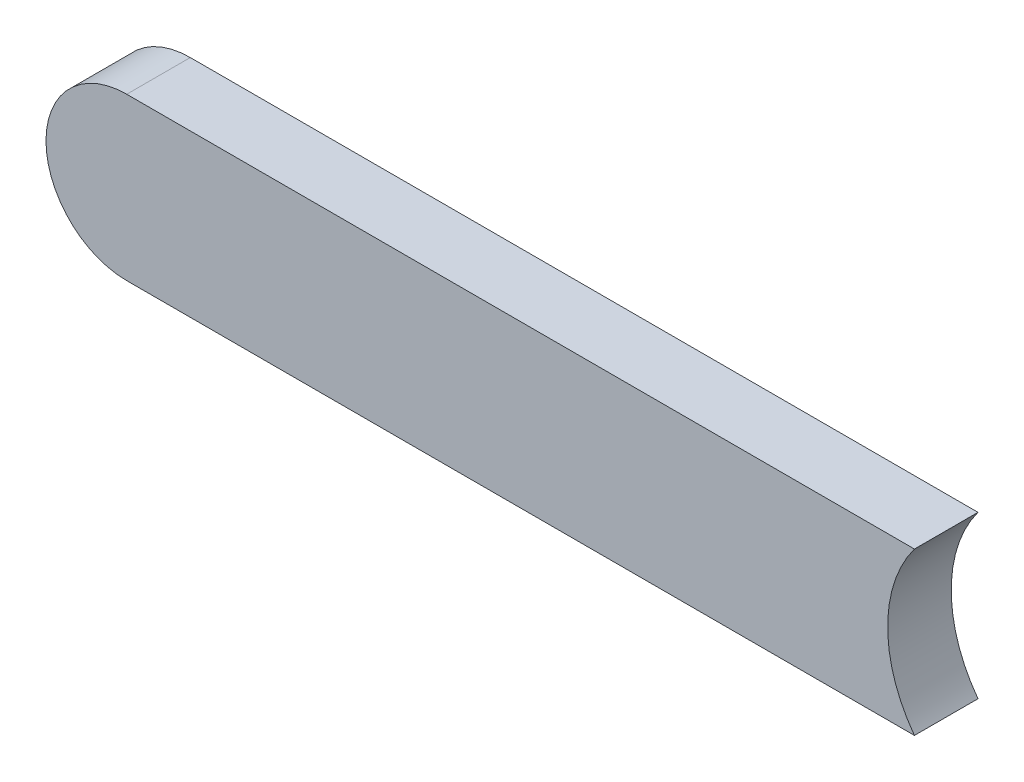
ISO-10303-21;
HEADER;
FILE_DESCRIPTION(('STEP AP214'),'2;1');
FILE_NAME('part.step','',(''),(''),'','','');
FILE_SCHEMA(('AUTOMOTIVE_DESIGN { 1 0 10303 214 1 1 1 1 }'));
ENDSEC;
DATA;
#1=APPLICATION_CONTEXT('core data for automotive mechanical design processes');
#2=APPLICATION_PROTOCOL_DEFINITION('international standard','automotive_design',2000,#1);
#3=PRODUCT_CONTEXT('',#1,'mechanical');
#4=PRODUCT('Part','Part','',(#3));
#5=PRODUCT_RELATED_PRODUCT_CATEGORY('part','',(#4));
#6=PRODUCT_DEFINITION_FORMATION('','',#4);
#7=PRODUCT_DEFINITION_CONTEXT('part definition',#1,'design');
#8=PRODUCT_DEFINITION('design','',#6,#7);
#9=PRODUCT_DEFINITION_SHAPE('','',#8);
#10=(LENGTH_UNIT() NAMED_UNIT(*) SI_UNIT(.MILLI.,.METRE.));
#11=(NAMED_UNIT(*) PLANE_ANGLE_UNIT() SI_UNIT($,.RADIAN.));
#12=(NAMED_UNIT(*) SI_UNIT($,.STERADIAN.) SOLID_ANGLE_UNIT());
#13=UNCERTAINTY_MEASURE_WITH_UNIT(LENGTH_MEASURE(1.E-05),#10,'distance_accuracy_value','');
#14=(GEOMETRIC_REPRESENTATION_CONTEXT(3) GLOBAL_UNCERTAINTY_ASSIGNED_CONTEXT((#13)) GLOBAL_UNIT_ASSIGNED_CONTEXT((#10,
#11,#12)) REPRESENTATION_CONTEXT('',''));
#15=CARTESIAN_POINT('',(0.,0.,0.));
#16=DIRECTION('',(0.,0.,1.));
#17=DIRECTION('',(1.,0.,0.));
#18=AXIS2_PLACEMENT_3D('',#15,#16,#17);
#19=CARTESIAN_POINT('',(136.8806,58.166,0.));
#20=DIRECTION('',(0.,1.,0.));
#21=DIRECTION('',(1.,0.,0.));
#22=AXIS2_PLACEMENT_3D('',#19,#20,#21);
#23=PLANE('',#22);
#24=DIRECTION('',(1.,0.,0.));
#25=VECTOR('',#24,1.);
#26=CARTESIAN_POINT('',(136.8806,58.166,0.1999996));
#27=LINE('',#26,#25);
#28=CARTESIAN_POINT('',(136.8806,58.166,0.1999996));
#29=VERTEX_POINT('',#28);
#30=CARTESIAN_POINT('',(139.359251768896,58.166,0.1999996));
#31=VERTEX_POINT('',#30);
#32=EDGE_CURVE('E11',#29,#31,#27,.T.);
#33=ORIENTED_EDGE('',*,*,#32,.F.);
#34=DIRECTION('',(0.,0.,1.));
#35=VECTOR('',#34,1.);
#36=CARTESIAN_POINT('',(136.8806,58.166,0.));
#37=LINE('',#36,#35);
#38=CARTESIAN_POINT('',(136.8806,58.166,0.));
#39=VERTEX_POINT('',#38);
#40=EDGE_CURVE('E24',#39,#29,#37,.T.);
#41=ORIENTED_EDGE('',*,*,#40,.F.);
#42=DIRECTION('',(1.,0.,0.));
#43=VECTOR('',#42,1.);
#44=CARTESIAN_POINT('',(136.8806,58.166,0.));
#45=LINE('',#44,#43);
#46=CARTESIAN_POINT('',(139.359251768896,58.166,0.));
#47=VERTEX_POINT('',#46);
#48=EDGE_CURVE('E75',#39,#47,#45,.T.);
#49=ORIENTED_EDGE('',*,*,#48,.T.);
#50=DIRECTION('',(0.,0.,1.));
#51=VECTOR('',#50,1.);
#52=CARTESIAN_POINT('',(139.359251768896,58.166,0.));
#53=LINE('',#52,#51);
#54=EDGE_CURVE('E37',#47,#31,#53,.T.);
#55=ORIENTED_EDGE('',*,*,#54,.T.);
#56=EDGE_LOOP('',(#33,#41,#49,#55));
#57=FACE_BOUND('',#56,.T.);
#58=ADVANCED_FACE('F17',(#57),#23,.F.);
#59=CARTESIAN_POINT('',(139.7,58.42,0.));
#60=DIRECTION('',(0.,0.,-1.));
#61=DIRECTION('',(1.,0.,0.));
#62=AXIS2_PLACEMENT_3D('',#59,#60,#61);
#63=CYLINDRICAL_SURFACE('',#62,0.42500042);
#64=DIRECTION('',(0.,0.,1.));
#65=VECTOR('',#64,1.);
#66=CARTESIAN_POINT('',(139.359251768896,58.674,0.));
#67=LINE('',#66,#65);
#68=CARTESIAN_POINT('',(139.359251768896,58.674,0.));
#69=VERTEX_POINT('',#68);
#70=CARTESIAN_POINT('',(139.359251768896,58.674,0.1999996));
#71=VERTEX_POINT('',#70);
#72=EDGE_CURVE('E67',#69,#71,#67,.T.);
#73=ORIENTED_EDGE('',*,*,#72,.T.);
#74=CARTESIAN_POINT('',(139.7,58.42,0.1999996));
#75=DIRECTION('',(0.,0.,1.));
#76=DIRECTION('',(1.,0.,0.));
#77=AXIS2_PLACEMENT_3D('',#74,#75,#76);
#78=CIRCLE('',#77,0.42500042);
#79=EDGE_CURVE('E82',#71,#31,#78,.T.);
#80=ORIENTED_EDGE('',*,*,#79,.T.);
#81=ORIENTED_EDGE('',*,*,#54,.F.);
#82=CARTESIAN_POINT('',(139.7,58.42,0.));
#83=DIRECTION('',(0.,0.,1.));
#84=DIRECTION('',(1.,0.,0.));
#85=AXIS2_PLACEMENT_3D('',#82,#83,#84);
#86=CIRCLE('',#85,0.42500042);
#87=EDGE_CURVE('E80',#69,#47,#86,.T.);
#88=ORIENTED_EDGE('',*,*,#87,.F.);
#89=EDGE_LOOP('',(#73,#80,#81,#88));
#90=FACE_BOUND('',#89,.T.);
#91=ADVANCED_FACE('F88',(#90),#63,.F.);
#92=CARTESIAN_POINT('',(139.359251768896,58.674,0.));
#93=DIRECTION('',(0.,-1.,0.));
#94=DIRECTION('',(-1.,0.,0.));
#95=AXIS2_PLACEMENT_3D('',#92,#93,#94);
#96=PLANE('',#95);
#97=DIRECTION('',(-1.,0.,0.));
#98=VECTOR('',#97,1.);
#99=CARTESIAN_POINT('',(139.7,58.674,0.1999996));
#100=LINE('',#99,#98);
#101=CARTESIAN_POINT('',(136.8806,58.674,0.1999996));
#102=VERTEX_POINT('',#101);
#103=EDGE_CURVE('E71',#71,#102,#100,.T.);
#104=ORIENTED_EDGE('',*,*,#103,.F.);
#105=ORIENTED_EDGE('',*,*,#72,.F.);
#106=DIRECTION('',(-1.,0.,0.));
#107=VECTOR('',#106,1.);
#108=CARTESIAN_POINT('',(139.7,58.674,0.));
#109=LINE('',#108,#107);
#110=CARTESIAN_POINT('',(136.8806,58.674,0.));
#111=VERTEX_POINT('',#110);
#112=EDGE_CURVE('E63',#69,#111,#109,.T.);
#113=ORIENTED_EDGE('',*,*,#112,.T.);
#114=DIRECTION('',(0.,0.,1.));
#115=VECTOR('',#114,1.);
#116=CARTESIAN_POINT('',(136.8806,58.674,0.));
#117=LINE('',#116,#115);
#118=EDGE_CURVE('E53',#111,#102,#117,.T.);
#119=ORIENTED_EDGE('',*,*,#118,.T.);
#120=EDGE_LOOP('',(#104,#105,#113,#119));
#121=FACE_BOUND('',#120,.T.);
#122=ADVANCED_FACE('F66',(#121),#96,.F.);
#123=CARTESIAN_POINT('',(136.8806,58.42,0.));
#124=DIRECTION('',(0.,0.,-1.));
#125=DIRECTION('',(-1.11896493820486E-13,1.,0.));
#126=AXIS2_PLACEMENT_3D('',#123,#124,#125);
#127=CYLINDRICAL_SURFACE('',#126,0.254000000000007);
#128=CARTESIAN_POINT('',(136.8806,58.42,0.1999996));
#129=DIRECTION('',(0.,0.,1.));
#130=DIRECTION('',(-1.11896493820486E-13,1.,0.));
#131=AXIS2_PLACEMENT_3D('',#128,#129,#130);
#132=CIRCLE('',#131,0.254000000000007);
#133=EDGE_CURVE('E59',#102,#29,#132,.T.);
#134=ORIENTED_EDGE('',*,*,#133,.F.);
#135=ORIENTED_EDGE('',*,*,#118,.F.);
#136=CARTESIAN_POINT('',(136.8806,58.42,0.));
#137=DIRECTION('',(0.,0.,1.));
#138=DIRECTION('',(-1.11896493820486E-13,1.,0.));
#139=AXIS2_PLACEMENT_3D('',#136,#137,#138);
#140=CIRCLE('',#139,0.254000000000007);
#141=EDGE_CURVE('E57',#111,#39,#140,.T.);
#142=ORIENTED_EDGE('',*,*,#141,.T.);
#143=ORIENTED_EDGE('',*,*,#40,.T.);
#144=EDGE_LOOP('',(#134,#135,#142,#143));
#145=FACE_BOUND('',#144,.T.);
#146=ADVANCED_FACE('F55',(#145),#127,.T.);
#147=CARTESIAN_POINT('',(136.8806,58.166,0.));
#148=DIRECTION('',(0.,0.,-1.));
#149=DIRECTION('',(-1.,0.,0.));
#150=AXIS2_PLACEMENT_3D('',#147,#148,#149);
#151=PLANE('',#150);
#152=ORIENTED_EDGE('',*,*,#48,.F.);
#153=ORIENTED_EDGE('',*,*,#141,.F.);
#154=ORIENTED_EDGE('',*,*,#112,.F.);
#155=ORIENTED_EDGE('',*,*,#87,.T.);
#156=EDGE_LOOP('',(#152,#153,#154,#155));
#157=FACE_BOUND('',#156,.T.);
#158=ADVANCED_FACE('F74',(#157),#151,.T.);
#159=CARTESIAN_POINT('',(136.8806,58.166,0.1999996));
#160=DIRECTION('',(0.,0.,-1.));
#161=DIRECTION('',(-1.,0.,0.));
#162=AXIS2_PLACEMENT_3D('',#159,#160,#161);
#163=PLANE('',#162);
#164=ORIENTED_EDGE('',*,*,#133,.T.);
#165=ORIENTED_EDGE('',*,*,#32,.T.);
#166=ORIENTED_EDGE('',*,*,#79,.F.);
#167=ORIENTED_EDGE('',*,*,#103,.T.);
#168=EDGE_LOOP('',(#164,#165,#166,#167));
#169=FACE_BOUND('',#168,.T.);
#170=ADVANCED_FACE('F91',(#169),#163,.F.);
#171=CLOSED_SHELL('',(#58,#91,#122,#146,#158,#170));
#172=MANIFOLD_SOLID_BREP('B1',#171);
#173=ADVANCED_BREP_SHAPE_REPRESENTATION('',(#18,#172),#14);
#174=SHAPE_DEFINITION_REPRESENTATION(#9,#173);
ENDSEC;
END-ISO-10303-21;
